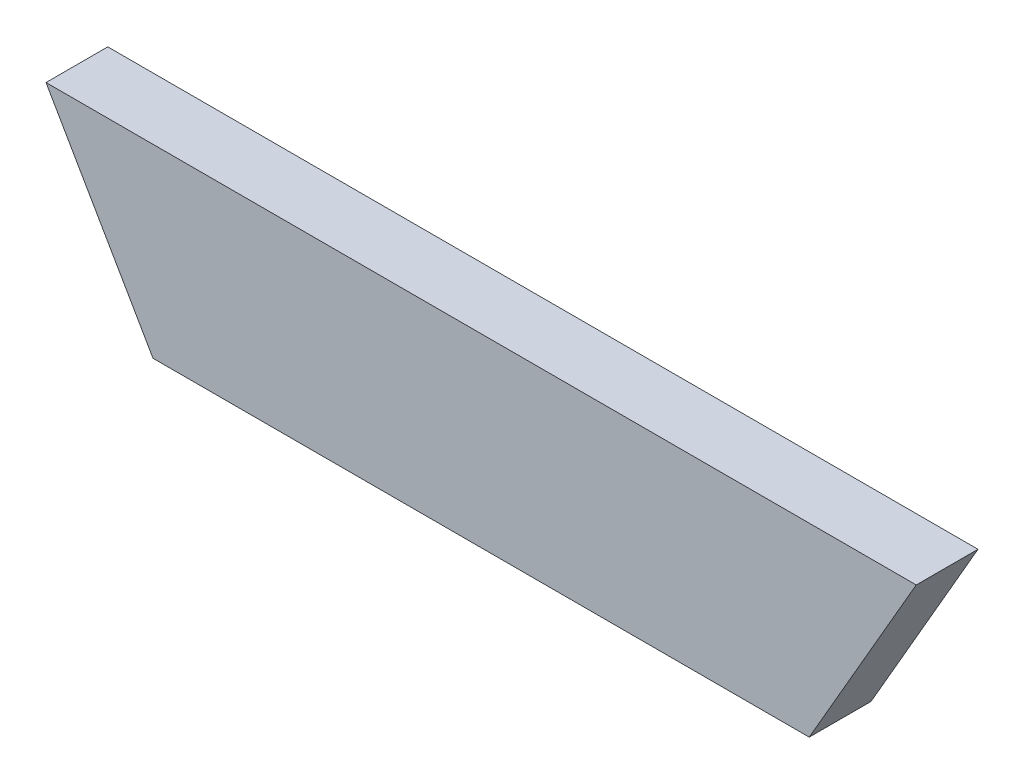
ISO-10303-21;
HEADER;
FILE_DESCRIPTION(('STEP AP214'),'2;1');
FILE_NAME('part.step','',(''),(''),'','','');
FILE_SCHEMA(('AUTOMOTIVE_DESIGN { 1 0 10303 214 1 1 1 1 }'));
ENDSEC;
DATA;
#1=APPLICATION_CONTEXT('core data for automotive mechanical design processes');
#2=APPLICATION_PROTOCOL_DEFINITION('international standard','automotive_design',2000,#1);
#3=PRODUCT_CONTEXT('',#1,'mechanical');
#4=PRODUCT('Part','Part','',(#3));
#5=PRODUCT_RELATED_PRODUCT_CATEGORY('part','',(#4));
#6=PRODUCT_DEFINITION_FORMATION('','',#4);
#7=PRODUCT_DEFINITION_CONTEXT('part definition',#1,'design');
#8=PRODUCT_DEFINITION('design','',#6,#7);
#9=PRODUCT_DEFINITION_SHAPE('','',#8);
#10=(LENGTH_UNIT() NAMED_UNIT(*) SI_UNIT(.MILLI.,.METRE.));
#11=(NAMED_UNIT(*) PLANE_ANGLE_UNIT() SI_UNIT($,.RADIAN.));
#12=(NAMED_UNIT(*) SI_UNIT($,.STERADIAN.) SOLID_ANGLE_UNIT());
#13=UNCERTAINTY_MEASURE_WITH_UNIT(LENGTH_MEASURE(1.E-05),#10,'distance_accuracy_value','');
#14=(GEOMETRIC_REPRESENTATION_CONTEXT(3) GLOBAL_UNCERTAINTY_ASSIGNED_CONTEXT((#13)) GLOBAL_UNIT_ASSIGNED_CONTEXT((#10,
#11,#12)) REPRESENTATION_CONTEXT('',''));
#15=CARTESIAN_POINT('',(0.,0.,0.));
#16=DIRECTION('',(0.,0.,1.));
#17=DIRECTION('',(1.,0.,0.));
#18=AXIS2_PLACEMENT_3D('',#15,#16,#17);
#19=CARTESIAN_POINT('',(-199.02232370725,39.1095985267382,15.));
#20=DIRECTION('',(0.86602540378444,0.499999999999998,0.));
#21=DIRECTION('',(-0.499999999999998,0.86602540378444,0.));
#22=AXIS2_PLACEMENT_3D('',#19,#20,#21);
#23=PLANE('',#22);
#24=DIRECTION('',(0.499999999999998,-0.86602540378444,0.));
#25=VECTOR('',#24,1.);
#26=CARTESIAN_POINT('',(-199.02232370725,39.1095985267382,0.));
#27=LINE('',#26,#25);
#28=CARTESIAN_POINT('',(-225.003085820783,84.1095985267383,0.));
#29=VERTEX_POINT('',#28);
#30=CARTESIAN_POINT('',(-199.02232370725,39.1095985267382,0.));
#31=VERTEX_POINT('',#30);
#32=EDGE_CURVE('E96',#29,#31,#27,.T.);
#33=ORIENTED_EDGE('',*,*,#32,.T.);
#34=DIRECTION('',(0.,0.,-1.));
#35=VECTOR('',#34,1.);
#36=CARTESIAN_POINT('',(-199.02232370725,39.1095985267382,15.));
#37=LINE('',#36,#35);
#38=CARTESIAN_POINT('',(-199.02232370725,39.1095985267382,15.));
#39=VERTEX_POINT('',#38);
#40=EDGE_CURVE('E11',#39,#31,#37,.T.);
#41=ORIENTED_EDGE('',*,*,#40,.F.);
#42=DIRECTION('',(0.499999999999998,-0.86602540378444,0.));
#43=VECTOR('',#42,1.);
#44=CARTESIAN_POINT('',(-199.02232370725,39.1095985267382,15.));
#45=LINE('',#44,#43);
#46=CARTESIAN_POINT('',(-225.003085820783,84.1095985267383,15.));
#47=VERTEX_POINT('',#46);
#48=EDGE_CURVE('E84',#47,#39,#45,.T.);
#49=ORIENTED_EDGE('',*,*,#48,.F.);
#50=DIRECTION('',(0.,0.,-1.));
#51=VECTOR('',#50,1.);
#52=CARTESIAN_POINT('',(-225.003085820783,84.1095985267383,15.));
#53=LINE('',#52,#51);
#54=EDGE_CURVE('E92',#47,#29,#53,.T.);
#55=ORIENTED_EDGE('',*,*,#54,.T.);
#56=EDGE_LOOP('',(#33,#41,#49,#55));
#57=FACE_BOUND('',#56,.T.);
#58=ADVANCED_FACE('F33',(#57),#23,.F.);
#59=CARTESIAN_POINT('',(-39.6638479343158,39.1095985267383,15.));
#60=DIRECTION('',(0.,1.,0.));
#61=DIRECTION('',(-1.,0.,0.));
#62=AXIS2_PLACEMENT_3D('',#59,#60,#61);
#63=PLANE('',#62);
#64=DIRECTION('',(1.,0.,0.));
#65=VECTOR('',#64,1.);
#66=CARTESIAN_POINT('',(-39.6638479343158,39.1095985267383,0.));
#67=LINE('',#66,#65);
#68=CARTESIAN_POINT('',(-39.6638479343158,39.1095985267383,0.));
#69=VERTEX_POINT('',#68);
#70=EDGE_CURVE('E88',#31,#69,#67,.T.);
#71=ORIENTED_EDGE('',*,*,#70,.T.);
#72=DIRECTION('',(0.,0.,-1.));
#73=VECTOR('',#72,1.);
#74=CARTESIAN_POINT('',(-39.6638479343158,39.1095985267383,15.));
#75=LINE('',#74,#73);
#76=CARTESIAN_POINT('',(-39.6638479343158,39.1095985267383,15.));
#77=VERTEX_POINT('',#76);
#78=EDGE_CURVE('E41',#77,#69,#75,.T.);
#79=ORIENTED_EDGE('',*,*,#78,.F.);
#80=DIRECTION('',(1.,0.,0.));
#81=VECTOR('',#80,1.);
#82=CARTESIAN_POINT('',(-39.6638479343158,39.1095985267383,15.));
#83=LINE('',#82,#81);
#84=EDGE_CURVE('E79',#39,#77,#83,.T.);
#85=ORIENTED_EDGE('',*,*,#84,.F.);
#86=ORIENTED_EDGE('',*,*,#40,.T.);
#87=EDGE_LOOP('',(#71,#79,#85,#86));
#88=FACE_BOUND('',#87,.T.);
#89=ADVANCED_FACE('F87',(#88),#63,.F.);
#90=CARTESIAN_POINT('',(-13.6830858207828,84.1095985267383,15.));
#91=DIRECTION('',(-0.86602540378444,0.499999999999998,0.));
#92=DIRECTION('',(-0.499999999999998,-0.86602540378444,0.));
#93=AXIS2_PLACEMENT_3D('',#90,#91,#92);
#94=PLANE('',#93);
#95=DIRECTION('',(0.499999999999998,0.86602540378444,0.));
#96=VECTOR('',#95,1.);
#97=CARTESIAN_POINT('',(-13.6830858207828,84.1095985267383,0.));
#98=LINE('',#97,#96);
#99=CARTESIAN_POINT('',(-13.6830858207828,84.1095985267383,0.));
#100=VERTEX_POINT('',#99);
#101=EDGE_CURVE('E66',#69,#100,#98,.T.);
#102=ORIENTED_EDGE('',*,*,#101,.T.);
#103=DIRECTION('',(0.,0.,-1.));
#104=VECTOR('',#103,1.);
#105=CARTESIAN_POINT('',(-13.6830858207828,84.1095985267383,15.));
#106=LINE('',#105,#104);
#107=CARTESIAN_POINT('',(-13.6830858207828,84.1095985267383,15.));
#108=VERTEX_POINT('',#107);
#109=EDGE_CURVE('E89',#108,#100,#106,.T.);
#110=ORIENTED_EDGE('',*,*,#109,.F.);
#111=DIRECTION('',(0.499999999999998,0.86602540378444,0.));
#112=VECTOR('',#111,1.);
#113=CARTESIAN_POINT('',(-13.6830858207828,84.1095985267383,15.));
#114=LINE('',#113,#112);
#115=EDGE_CURVE('E82',#77,#108,#114,.T.);
#116=ORIENTED_EDGE('',*,*,#115,.F.);
#117=ORIENTED_EDGE('',*,*,#78,.T.);
#118=EDGE_LOOP('',(#102,#110,#116,#117));
#119=FACE_BOUND('',#118,.T.);
#120=ADVANCED_FACE('F90',(#119),#94,.F.);
#121=CARTESIAN_POINT('',(-225.003085820783,84.1095985267383,15.));
#122=DIRECTION('',(0.,-1.,0.));
#123=DIRECTION('',(0.,0.,-1.));
#124=AXIS2_PLACEMENT_3D('',#121,#122,#123);
#125=PLANE('',#124);
#126=DIRECTION('',(-1.,0.,0.));
#127=VECTOR('',#126,1.);
#128=CARTESIAN_POINT('',(-225.003085820783,84.1095985267383,0.));
#129=LINE('',#128,#127);
#130=EDGE_CURVE('E72',#100,#29,#129,.T.);
#131=ORIENTED_EDGE('',*,*,#130,.T.);
#132=ORIENTED_EDGE('',*,*,#54,.F.);
#133=DIRECTION('',(-1.,0.,0.));
#134=VECTOR('',#133,1.);
#135=CARTESIAN_POINT('',(-225.003085820783,84.1095985267383,15.));
#136=LINE('',#135,#134);
#137=EDGE_CURVE('E49',#108,#47,#136,.T.);
#138=ORIENTED_EDGE('',*,*,#137,.F.);
#139=ORIENTED_EDGE('',*,*,#109,.T.);
#140=EDGE_LOOP('',(#131,#132,#138,#139));
#141=FACE_BOUND('',#140,.T.);
#142=ADVANCED_FACE('F103',(#141),#125,.F.);
#143=CARTESIAN_POINT('',(0.,0.,15.));
#144=DIRECTION('',(0.,0.,-1.));
#145=DIRECTION('',(-1.,0.,0.));
#146=AXIS2_PLACEMENT_3D('',#143,#144,#145);
#147=PLANE('',#146);
#148=ORIENTED_EDGE('',*,*,#48,.T.);
#149=ORIENTED_EDGE('',*,*,#84,.T.);
#150=ORIENTED_EDGE('',*,*,#115,.T.);
#151=ORIENTED_EDGE('',*,*,#137,.T.);
#152=EDGE_LOOP('',(#148,#149,#150,#151));
#153=FACE_BOUND('',#152,.T.);
#154=ADVANCED_FACE('F80',(#153),#147,.F.);
#155=CARTESIAN_POINT('',(0.,0.,0.));
#156=DIRECTION('',(0.,0.,-1.));
#157=DIRECTION('',(-1.,0.,0.));
#158=AXIS2_PLACEMENT_3D('',#155,#156,#157);
#159=PLANE('',#158);
#160=ORIENTED_EDGE('',*,*,#32,.F.);
#161=ORIENTED_EDGE('',*,*,#130,.F.);
#162=ORIENTED_EDGE('',*,*,#101,.F.);
#163=ORIENTED_EDGE('',*,*,#70,.F.);
#164=EDGE_LOOP('',(#160,#161,#162,#163));
#165=FACE_BOUND('',#164,.T.);
#166=ADVANCED_FACE('F106',(#165),#159,.T.);
#167=CLOSED_SHELL('',(#58,#89,#120,#142,#154,#166));
#168=MANIFOLD_SOLID_BREP('B2',#167);
#169=ADVANCED_BREP_SHAPE_REPRESENTATION('',(#18,#168),#14);
#170=SHAPE_DEFINITION_REPRESENTATION(#9,#169);
ENDSEC;
END-ISO-10303-21;
